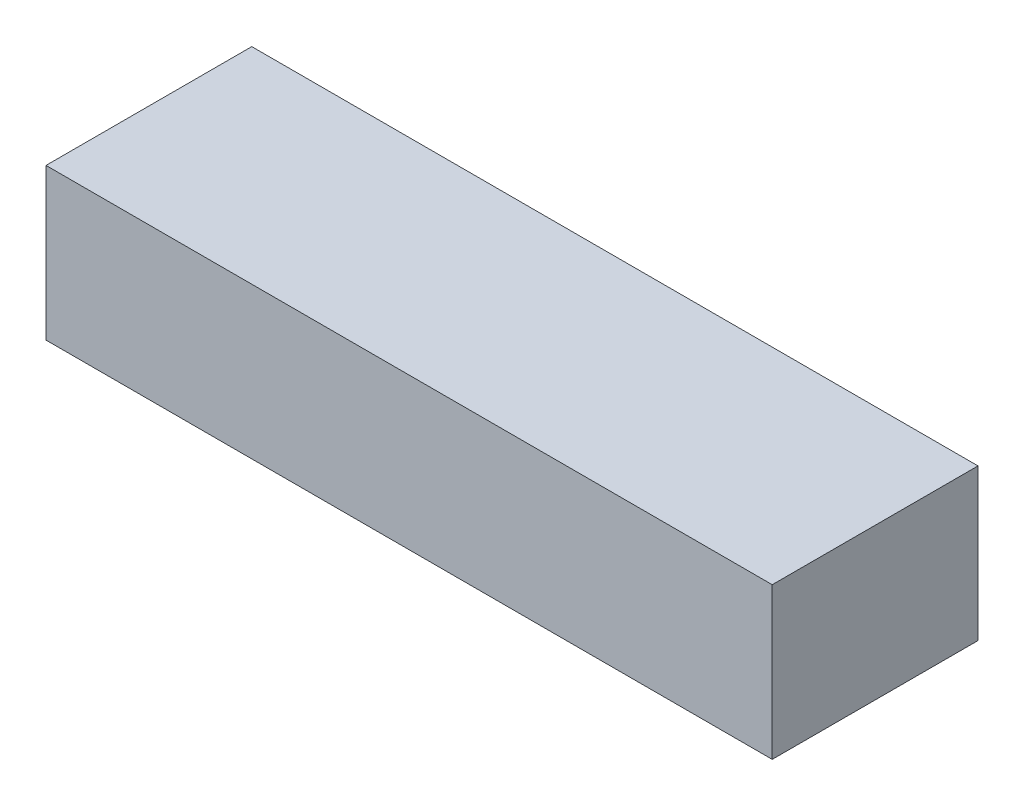
ISO-10303-21;
HEADER;
FILE_DESCRIPTION(('STEP AP214'),'2;1');
FILE_NAME('part.step','',(''),(''),'','','');
FILE_SCHEMA(('AUTOMOTIVE_DESIGN { 1 0 10303 214 1 1 1 1 }'));
ENDSEC;
DATA;
#1=APPLICATION_CONTEXT('core data for automotive mechanical design processes');
#2=APPLICATION_PROTOCOL_DEFINITION('international standard','automotive_design',2000,#1);
#3=PRODUCT_CONTEXT('',#1,'mechanical');
#4=PRODUCT('Part','Part','',(#3));
#5=PRODUCT_RELATED_PRODUCT_CATEGORY('part','',(#4));
#6=PRODUCT_DEFINITION_FORMATION('','',#4);
#7=PRODUCT_DEFINITION_CONTEXT('part definition',#1,'design');
#8=PRODUCT_DEFINITION('design','',#6,#7);
#9=PRODUCT_DEFINITION_SHAPE('','',#8);
#10=(LENGTH_UNIT() NAMED_UNIT(*) SI_UNIT(.MILLI.,.METRE.));
#11=(NAMED_UNIT(*) PLANE_ANGLE_UNIT() SI_UNIT($,.RADIAN.));
#12=(NAMED_UNIT(*) SI_UNIT($,.STERADIAN.) SOLID_ANGLE_UNIT());
#13=UNCERTAINTY_MEASURE_WITH_UNIT(LENGTH_MEASURE(1.E-05),#10,'distance_accuracy_value','');
#14=(GEOMETRIC_REPRESENTATION_CONTEXT(3) GLOBAL_UNCERTAINTY_ASSIGNED_CONTEXT((#13)) GLOBAL_UNIT_ASSIGNED_CONTEXT((#10,
#11,#12)) REPRESENTATION_CONTEXT('',''));
#15=CARTESIAN_POINT('',(0.,0.,0.));
#16=DIRECTION('',(0.,0.,1.));
#17=DIRECTION('',(1.,0.,0.));
#18=AXIS2_PLACEMENT_3D('',#15,#16,#17);
#19=CARTESIAN_POINT('',(-60.,25.,17.));
#20=DIRECTION('',(1.,0.,0.));
#21=DIRECTION('',(0.,0.,-1.));
#22=AXIS2_PLACEMENT_3D('',#19,#20,#21);
#23=PLANE('',#22);
#24=DIRECTION('',(0.,0.,1.));
#25=VECTOR('',#24,1.);
#26=CARTESIAN_POINT('',(-60.,0.,17.));
#27=LINE('',#26,#25);
#28=CARTESIAN_POINT('',(-60.,0.,-17.));
#29=VERTEX_POINT('',#28);
#30=CARTESIAN_POINT('',(-60.,0.,17.));
#31=VERTEX_POINT('',#30);
#32=EDGE_CURVE('E174',#29,#31,#27,.T.);
#33=ORIENTED_EDGE('',*,*,#32,.T.);
#34=DIRECTION('',(0.,-1.,0.));
#35=VECTOR('',#34,1.);
#36=CARTESIAN_POINT('',(-60.,25.,17.));
#37=LINE('',#36,#35);
#38=CARTESIAN_POINT('',(-60.,25.,17.));
#39=VERTEX_POINT('',#38);
#40=EDGE_CURVE('E182',#39,#31,#37,.T.);
#41=ORIENTED_EDGE('',*,*,#40,.F.);
#42=DIRECTION('',(0.,0.,1.));
#43=VECTOR('',#42,1.);
#44=CARTESIAN_POINT('',(-60.,25.,17.));
#45=LINE('',#44,#43);
#46=CARTESIAN_POINT('',(-60.,25.,-17.));
#47=VERTEX_POINT('',#46);
#48=EDGE_CURVE('E165',#47,#39,#45,.T.);
#49=ORIENTED_EDGE('',*,*,#48,.F.);
#50=DIRECTION('',(0.,-1.,0.));
#51=VECTOR('',#50,1.);
#52=CARTESIAN_POINT('',(-60.,25.,-17.));
#53=LINE('',#52,#51);
#54=EDGE_CURVE('E54',#47,#29,#53,.T.);
#55=ORIENTED_EDGE('',*,*,#54,.T.);
#56=EDGE_LOOP('',(#33,#41,#49,#55));
#57=FACE_BOUND('',#56,.T.);
#58=DIRECTION('',(0.,0.750607029093535,0.660748884127228));
#59=VECTOR('',#58,1.);
#60=CARTESIAN_POINT('',(-60.,4.56763191500144,2.75805234733397));
#61=LINE('',#60,#59);
#62=CARTESIAN_POINT('',(-60.,4.56763191500144,2.75805234733397));
#63=VERTEX_POINT('',#62);
#64=CARTESIAN_POINT('',(-60.,10.8411338414313,8.28052847237705));
#65=VERTEX_POINT('',#64);
#66=EDGE_CURVE('E61',#63,#65,#61,.T.);
#67=ORIENTED_EDGE('',*,*,#66,.F.);
#68=DIRECTION('',(0.,-0.196921804629632,0.980419197517781));
#69=VECTOR('',#68,1.);
#70=CARTESIAN_POINT('',(-60.,6.21348556786685,-5.43619775416646));
#71=LINE('',#70,#69);
#72=CARTESIAN_POINT('',(-60.,6.21348556786685,-5.43619775416646));
#73=VERTEX_POINT('',#72);
#74=EDGE_CURVE('E65',#73,#63,#71,.T.);
#75=ORIENTED_EDGE('',*,*,#74,.F.);
#76=DIRECTION('',(0.,-0.947528833723167,0.319670313390553));
#77=VECTOR('',#76,1.);
#78=CARTESIAN_POINT('',(-60.,14.1328411471621,-8.10797173062382));
#79=LINE('',#78,#77);
#80=CARTESIAN_POINT('',(-60.,14.1328411471621,-8.10797173062382));
#81=VERTEX_POINT('',#80);
#82=EDGE_CURVE('E322',#81,#73,#79,.T.);
#83=ORIENTED_EDGE('',*,*,#82,.F.);
#84=DIRECTION('',(0.,-0.750607029093535,-0.660748884127227));
#85=VECTOR('',#84,1.);
#86=CARTESIAN_POINT('',(-60.,20.406343073592,-2.58549560558074));
#87=LINE('',#86,#85);
#88=CARTESIAN_POINT('',(-60.,20.406343073592,-2.58549560558074));
#89=VERTEX_POINT('',#88);
#90=EDGE_CURVE('E342',#89,#81,#87,.T.);
#91=ORIENTED_EDGE('',*,*,#90,.F.);
#92=DIRECTION('',(0.,0.196921804629632,-0.980419197517781));
#93=VECTOR('',#92,1.);
#94=CARTESIAN_POINT('',(-60.,18.7604894207266,5.60875449591969));
#95=LINE('',#94,#93);
#96=CARTESIAN_POINT('',(-60.,18.7604894207266,5.60875449591969));
#97=VERTEX_POINT('',#96);
#98=EDGE_CURVE('E345',#97,#89,#95,.T.);
#99=ORIENTED_EDGE('',*,*,#98,.F.);
#100=DIRECTION('',(0.,0.947528833723167,-0.319670313390553));
#101=VECTOR('',#100,1.);
#102=CARTESIAN_POINT('',(-60.,10.8411338414313,8.28052847237705));
#103=LINE('',#102,#101);
#104=EDGE_CURVE('E347',#65,#97,#103,.T.);
#105=ORIENTED_EDGE('',*,*,#104,.F.);
#106=EDGE_LOOP('',(#67,#75,#83,#91,#99,#105));
#107=FACE_BOUND('',#106,.T.);
#108=ADVANCED_FACE('F45',(#57,#107),#23,.F.);
#109=CARTESIAN_POINT('',(60.,25.,17.));
#110=DIRECTION('',(-1.,0.,0.));
#111=DIRECTION('',(0.,0.,1.));
#112=AXIS2_PLACEMENT_3D('',#109,#110,#111);
#113=PLANE('',#112);
#114=DIRECTION('',(0.,0.,-1.));
#115=VECTOR('',#114,1.);
#116=CARTESIAN_POINT('',(60.,0.,17.));
#117=LINE('',#116,#115);
#118=CARTESIAN_POINT('',(60.,0.,17.));
#119=VERTEX_POINT('',#118);
#120=CARTESIAN_POINT('',(60.,0.,-17.));
#121=VERTEX_POINT('',#120);
#122=EDGE_CURVE('E146',#119,#121,#117,.T.);
#123=ORIENTED_EDGE('',*,*,#122,.T.);
#124=DIRECTION('',(0.,-1.,0.));
#125=VECTOR('',#124,1.);
#126=CARTESIAN_POINT('',(60.,25.,-17.));
#127=LINE('',#126,#125);
#128=CARTESIAN_POINT('',(60.,25.,-17.));
#129=VERTEX_POINT('',#128);
#130=EDGE_CURVE('E11',#129,#121,#127,.T.);
#131=ORIENTED_EDGE('',*,*,#130,.F.);
#132=DIRECTION('',(0.,0.,-1.));
#133=VECTOR('',#132,1.);
#134=CARTESIAN_POINT('',(60.,25.,17.));
#135=LINE('',#134,#133);
#136=CARTESIAN_POINT('',(60.,25.,17.));
#137=VERTEX_POINT('',#136);
#138=EDGE_CURVE('E157',#137,#129,#135,.T.);
#139=ORIENTED_EDGE('',*,*,#138,.F.);
#140=DIRECTION('',(0.,-1.,0.));
#141=VECTOR('',#140,1.);
#142=CARTESIAN_POINT('',(60.,25.,17.));
#143=LINE('',#142,#141);
#144=EDGE_CURVE('E170',#137,#119,#143,.T.);
#145=ORIENTED_EDGE('',*,*,#144,.T.);
#146=EDGE_LOOP('',(#123,#131,#139,#145));
#147=FACE_BOUND('',#146,.T.);
#148=ADVANCED_FACE('F47',(#147),#113,.F.);
#149=CARTESIAN_POINT('',(-60.,25.,-17.));
#150=DIRECTION('',(0.,0.,1.));
#151=DIRECTION('',(1.,0.,0.));
#152=AXIS2_PLACEMENT_3D('',#149,#150,#151);
#153=PLANE('',#152);
#154=DIRECTION('',(-1.,0.,0.));
#155=VECTOR('',#154,1.);
#156=CARTESIAN_POINT('',(-60.,0.,-17.));
#157=LINE('',#156,#155);
#158=EDGE_CURVE('E151',#121,#29,#157,.T.);
#159=ORIENTED_EDGE('',*,*,#158,.T.);
#160=ORIENTED_EDGE('',*,*,#54,.F.);
#161=DIRECTION('',(-1.,0.,0.));
#162=VECTOR('',#161,1.);
#163=CARTESIAN_POINT('',(-60.,25.,-17.));
#164=LINE('',#163,#162);
#165=EDGE_CURVE('E161',#129,#47,#164,.T.);
#166=ORIENTED_EDGE('',*,*,#165,.F.);
#167=ORIENTED_EDGE('',*,*,#130,.T.);
#168=EDGE_LOOP('',(#159,#160,#166,#167));
#169=FACE_BOUND('',#168,.T.);
#170=ADVANCED_FACE('F206',(#169),#153,.F.);
#171=CARTESIAN_POINT('',(-60.,25.,17.));
#172=DIRECTION('',(0.,0.,-1.));
#173=DIRECTION('',(-1.,0.,0.));
#174=AXIS2_PLACEMENT_3D('',#171,#172,#173);
#175=PLANE('',#174);
#176=DIRECTION('',(1.,0.,0.));
#177=VECTOR('',#176,1.);
#178=CARTESIAN_POINT('',(-60.,0.,17.));
#179=LINE('',#178,#177);
#180=EDGE_CURVE('E162',#31,#119,#179,.T.);
#181=ORIENTED_EDGE('',*,*,#180,.T.);
#182=ORIENTED_EDGE('',*,*,#144,.F.);
#183=DIRECTION('',(1.,0.,0.));
#184=VECTOR('',#183,1.);
#185=CARTESIAN_POINT('',(-60.,25.,17.));
#186=LINE('',#185,#184);
#187=EDGE_CURVE('E168',#39,#137,#186,.T.);
#188=ORIENTED_EDGE('',*,*,#187,.F.);
#189=ORIENTED_EDGE('',*,*,#40,.T.);
#190=EDGE_LOOP('',(#181,#182,#188,#189));
#191=FACE_BOUND('',#190,.T.);
#192=ADVANCED_FACE('F199',(#191),#175,.F.);
#193=CARTESIAN_POINT('',(0.,25.,0.));
#194=DIRECTION('',(0.,-1.,0.));
#195=DIRECTION('',(0.,0.,-1.));
#196=AXIS2_PLACEMENT_3D('',#193,#194,#195);
#197=PLANE('',#196);
#198=ORIENTED_EDGE('',*,*,#138,.T.);
#199=ORIENTED_EDGE('',*,*,#165,.T.);
#200=ORIENTED_EDGE('',*,*,#48,.T.);
#201=ORIENTED_EDGE('',*,*,#187,.T.);
#202=EDGE_LOOP('',(#198,#199,#200,#201));
#203=FACE_BOUND('',#202,.T.);
#204=ADVANCED_FACE('F205',(#203),#197,.F.);
#205=CARTESIAN_POINT('',(0.,0.,0.));
#206=DIRECTION('',(0.,-1.,0.));
#207=DIRECTION('',(0.,0.,-1.));
#208=AXIS2_PLACEMENT_3D('',#205,#206,#207);
#209=PLANE('',#208);
#210=ORIENTED_EDGE('',*,*,#122,.F.);
#211=ORIENTED_EDGE('',*,*,#180,.F.);
#212=ORIENTED_EDGE('',*,*,#32,.F.);
#213=ORIENTED_EDGE('',*,*,#158,.F.);
#214=EDGE_LOOP('',(#210,#211,#212,#213));
#215=FACE_BOUND('',#214,.T.);
#216=ADVANCED_FACE('F196',(#215),#209,.T.);
#217=CARTESIAN_POINT('',(-62.,4.56763191500144,2.75805234733397));
#218=DIRECTION('',(0.,0.660748884127228,-0.750607029093535));
#219=DIRECTION('',(0.,0.750607029093535,0.660748884127228));
#220=AXIS2_PLACEMENT_3D('',#217,#218,#219);
#221=PLANE('',#220);
#222=ORIENTED_EDGE('',*,*,#66,.T.);
#223=DIRECTION('',(1.,0.,0.));
#224=VECTOR('',#223,1.);
#225=CARTESIAN_POINT('',(-62.,10.8411338414313,8.28052847237705));
#226=LINE('',#225,#224);
#227=CARTESIAN_POINT('',(-62.,10.8411338414313,8.28052847237705));
#228=VERTEX_POINT('',#227);
#229=EDGE_CURVE('E126',#228,#65,#226,.T.);
#230=ORIENTED_EDGE('',*,*,#229,.F.);
#231=DIRECTION('',(0.,0.750607029093535,0.660748884127228));
#232=VECTOR('',#231,1.);
#233=CARTESIAN_POINT('',(-62.,4.56763191500144,2.75805234733397));
#234=LINE('',#233,#232);
#235=CARTESIAN_POINT('',(-62.,4.56763191500144,2.75805234733397));
#236=VERTEX_POINT('',#235);
#237=EDGE_CURVE('E133',#236,#228,#234,.T.);
#238=ORIENTED_EDGE('',*,*,#237,.F.);
#239=DIRECTION('',(1.,0.,0.));
#240=VECTOR('',#239,1.);
#241=CARTESIAN_POINT('',(-62.,4.56763191500144,2.75805234733397));
#242=LINE('',#241,#240);
#243=EDGE_CURVE('E318',#236,#63,#242,.T.);
#244=ORIENTED_EDGE('',*,*,#243,.T.);
#245=EDGE_LOOP('',(#222,#230,#238,#244));
#246=FACE_BOUND('',#245,.T.);
#247=ADVANCED_FACE('F144',(#246),#221,.F.);
#248=CARTESIAN_POINT('',(-62.,10.8411338414313,8.28052847237705));
#249=DIRECTION('',(0.,-0.319670313390553,-0.947528833723168));
#250=DIRECTION('',(0.,0.947528833723168,-0.319670313390553));
#251=AXIS2_PLACEMENT_3D('',#248,#249,#250);
#252=PLANE('',#251);
#253=ORIENTED_EDGE('',*,*,#104,.T.);
#254=DIRECTION('',(1.,0.,0.));
#255=VECTOR('',#254,1.);
#256=CARTESIAN_POINT('',(-62.,18.7604894207266,5.60875449591969));
#257=LINE('',#256,#255);
#258=CARTESIAN_POINT('',(-62.,18.7604894207266,5.60875449591969));
#259=VERTEX_POINT('',#258);
#260=EDGE_CURVE('E128',#259,#97,#257,.T.);
#261=ORIENTED_EDGE('',*,*,#260,.F.);
#262=DIRECTION('',(0.,0.947528833723167,-0.319670313390553));
#263=VECTOR('',#262,1.);
#264=CARTESIAN_POINT('',(-62.,10.8411338414313,8.28052847237705));
#265=LINE('',#264,#263);
#266=EDGE_CURVE('E121',#228,#259,#265,.T.);
#267=ORIENTED_EDGE('',*,*,#266,.F.);
#268=ORIENTED_EDGE('',*,*,#229,.T.);
#269=EDGE_LOOP('',(#253,#261,#267,#268));
#270=FACE_BOUND('',#269,.T.);
#271=ADVANCED_FACE('F124',(#270),#252,.F.);
#272=CARTESIAN_POINT('',(-62.,18.7604894207266,5.60875449591969));
#273=DIRECTION('',(0.,-0.980419197517781,-0.196921804629632));
#274=DIRECTION('',(0.,0.196921804629632,-0.980419197517781));
#275=AXIS2_PLACEMENT_3D('',#272,#273,#274);
#276=PLANE('',#275);
#277=ORIENTED_EDGE('',*,*,#98,.T.);
#278=DIRECTION('',(1.,0.,0.));
#279=VECTOR('',#278,1.);
#280=CARTESIAN_POINT('',(-62.,20.406343073592,-2.58549560558074));
#281=LINE('',#280,#279);
#282=CARTESIAN_POINT('',(-62.,20.406343073592,-2.58549560558074));
#283=VERTEX_POINT('',#282);
#284=EDGE_CURVE('E153',#283,#89,#281,.T.);
#285=ORIENTED_EDGE('',*,*,#284,.F.);
#286=DIRECTION('',(0.,0.196921804629632,-0.980419197517781));
#287=VECTOR('',#286,1.);
#288=CARTESIAN_POINT('',(-62.,18.7604894207266,5.60875449591969));
#289=LINE('',#288,#287);
#290=EDGE_CURVE('E132',#259,#283,#289,.T.);
#291=ORIENTED_EDGE('',*,*,#290,.F.);
#292=ORIENTED_EDGE('',*,*,#260,.T.);
#293=EDGE_LOOP('',(#277,#285,#291,#292));
#294=FACE_BOUND('',#293,.T.);
#295=ADVANCED_FACE('F226',(#294),#276,.F.);
#296=CARTESIAN_POINT('',(-62.,20.406343073592,-2.58549560558074));
#297=DIRECTION('',(0.,-0.660748884127227,0.750607029093536));
#298=DIRECTION('',(0.,-0.750607029093536,-0.660748884127227));
#299=AXIS2_PLACEMENT_3D('',#296,#297,#298);
#300=PLANE('',#299);
#301=ORIENTED_EDGE('',*,*,#90,.T.);
#302=DIRECTION('',(1.,0.,0.));
#303=VECTOR('',#302,1.);
#304=CARTESIAN_POINT('',(-62.,14.1328411471621,-8.10797173062382));
#305=LINE('',#304,#303);
#306=CARTESIAN_POINT('',(-62.,14.1328411471621,-8.10797173062382));
#307=VERTEX_POINT('',#306);
#308=EDGE_CURVE('E328',#307,#81,#305,.T.);
#309=ORIENTED_EDGE('',*,*,#308,.F.);
#310=DIRECTION('',(0.,-0.750607029093535,-0.660748884127227));
#311=VECTOR('',#310,1.);
#312=CARTESIAN_POINT('',(-62.,20.406343073592,-2.58549560558074));
#313=LINE('',#312,#311);
#314=EDGE_CURVE('E343',#283,#307,#313,.T.);
#315=ORIENTED_EDGE('',*,*,#314,.F.);
#316=ORIENTED_EDGE('',*,*,#284,.T.);
#317=EDGE_LOOP('',(#301,#309,#315,#316));
#318=FACE_BOUND('',#317,.T.);
#319=ADVANCED_FACE('F229',(#318),#300,.F.);
#320=CARTESIAN_POINT('',(-62.,14.1328411471621,-8.10797173062382));
#321=DIRECTION('',(0.,0.319670313390553,0.947528833723168));
#322=DIRECTION('',(0.,-0.947528833723168,0.319670313390553));
#323=AXIS2_PLACEMENT_3D('',#320,#321,#322);
#324=PLANE('',#323);
#325=ORIENTED_EDGE('',*,*,#82,.T.);
#326=DIRECTION('',(1.,0.,0.));
#327=VECTOR('',#326,1.);
#328=CARTESIAN_POINT('',(-62.,6.21348556786685,-5.43619775416646));
#329=LINE('',#328,#327);
#330=CARTESIAN_POINT('',(-62.,6.21348556786685,-5.43619775416646));
#331=VERTEX_POINT('',#330);
#332=EDGE_CURVE('E320',#331,#73,#329,.T.);
#333=ORIENTED_EDGE('',*,*,#332,.F.);
#334=DIRECTION('',(0.,-0.947528833723167,0.319670313390553));
#335=VECTOR('',#334,1.);
#336=CARTESIAN_POINT('',(-62.,14.1328411471621,-8.10797173062382));
#337=LINE('',#336,#335);
#338=EDGE_CURVE('E330',#307,#331,#337,.T.);
#339=ORIENTED_EDGE('',*,*,#338,.F.);
#340=ORIENTED_EDGE('',*,*,#308,.T.);
#341=EDGE_LOOP('',(#325,#333,#339,#340));
#342=FACE_BOUND('',#341,.T.);
#343=ADVANCED_FACE('F233',(#342),#324,.F.);
#344=CARTESIAN_POINT('',(-62.,6.21348556786685,-5.43619775416646));
#345=DIRECTION('',(0.,0.980419197517781,0.196921804629632));
#346=DIRECTION('',(0.,-0.196921804629632,0.980419197517781));
#347=AXIS2_PLACEMENT_3D('',#344,#345,#346);
#348=PLANE('',#347);
#349=ORIENTED_EDGE('',*,*,#74,.T.);
#350=ORIENTED_EDGE('',*,*,#243,.F.);
#351=DIRECTION('',(0.,-0.196921804629632,0.980419197517781));
#352=VECTOR('',#351,1.);
#353=CARTESIAN_POINT('',(-62.,6.21348556786685,-5.43619775416646));
#354=LINE('',#353,#352);
#355=EDGE_CURVE('E138',#331,#236,#354,.T.);
#356=ORIENTED_EDGE('',*,*,#355,.F.);
#357=ORIENTED_EDGE('',*,*,#332,.T.);
#358=EDGE_LOOP('',(#349,#350,#356,#357));
#359=FACE_BOUND('',#358,.T.);
#360=ADVANCED_FACE('F237',(#359),#348,.F.);
#361=CARTESIAN_POINT('',(-62.,0.,0.));
#362=DIRECTION('',(-1.,0.,0.));
#363=DIRECTION('',(0.,0.,1.));
#364=AXIS2_PLACEMENT_3D('',#361,#362,#363);
#365=PLANE('',#364);
#366=ORIENTED_EDGE('',*,*,#237,.T.);
#367=ORIENTED_EDGE('',*,*,#266,.T.);
#368=ORIENTED_EDGE('',*,*,#290,.T.);
#369=ORIENTED_EDGE('',*,*,#314,.T.);
#370=ORIENTED_EDGE('',*,*,#338,.T.);
#371=ORIENTED_EDGE('',*,*,#355,.T.);
#372=EDGE_LOOP('',(#366,#367,#368,#369,#370,#371));
#373=FACE_BOUND('',#372,.T.);
#374=ADVANCED_FACE('F136',(#373),#365,.T.);
#375=CLOSED_SHELL('',(#108,#148,#170,#192,#204,#216,#247,#271,#295,#319,#343,#360,#374));
#376=MANIFOLD_SOLID_BREP('B2',#375);
#377=ADVANCED_BREP_SHAPE_REPRESENTATION('',(#18,#376),#14);
#378=SHAPE_DEFINITION_REPRESENTATION(#9,#377);
ENDSEC;
END-ISO-10303-21;
